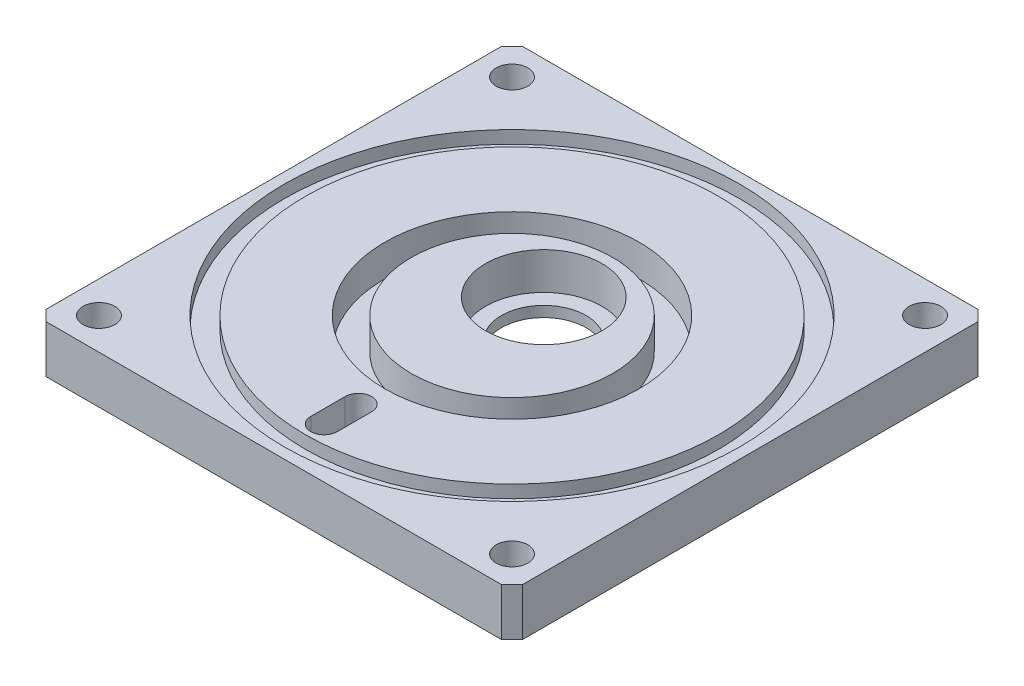
ISO-10303-21;
HEADER;
FILE_DESCRIPTION(('STEP AP214'),'2;1');
FILE_NAME('part.step','',(''),(''),'','','');
FILE_SCHEMA(('AUTOMOTIVE_DESIGN { 1 0 10303 214 1 1 1 1 }'));
ENDSEC;
DATA;
#1=APPLICATION_CONTEXT('core data for automotive mechanical design processes');
#2=APPLICATION_PROTOCOL_DEFINITION('international standard','automotive_design',2000,#1);
#3=PRODUCT_CONTEXT('',#1,'mechanical');
#4=PRODUCT('Part','Part','',(#3));
#5=PRODUCT_RELATED_PRODUCT_CATEGORY('part','',(#4));
#6=PRODUCT_DEFINITION_FORMATION('','',#4);
#7=PRODUCT_DEFINITION_CONTEXT('part definition',#1,'design');
#8=PRODUCT_DEFINITION('design','',#6,#7);
#9=PRODUCT_DEFINITION_SHAPE('','',#8);
#10=(LENGTH_UNIT() NAMED_UNIT(*) SI_UNIT(.MILLI.,.METRE.));
#11=(NAMED_UNIT(*) PLANE_ANGLE_UNIT() SI_UNIT($,.RADIAN.));
#12=(NAMED_UNIT(*) SI_UNIT($,.STERADIAN.) SOLID_ANGLE_UNIT());
#13=UNCERTAINTY_MEASURE_WITH_UNIT(LENGTH_MEASURE(1.E-05),#10,'distance_accuracy_value','');
#14=(GEOMETRIC_REPRESENTATION_CONTEXT(3) GLOBAL_UNCERTAINTY_ASSIGNED_CONTEXT((#13)) GLOBAL_UNIT_ASSIGNED_CONTEXT((#10,
#11,#12)) REPRESENTATION_CONTEXT('',''));
#15=CARTESIAN_POINT('',(0.,0.,0.));
#16=DIRECTION('',(0.,0.,1.));
#17=DIRECTION('',(1.,0.,0.));
#18=AXIS2_PLACEMENT_3D('',#15,#16,#17);
#19=CARTESIAN_POINT('',(0.,4.5,0.));
#20=DIRECTION('',(0.,-1.,0.));
#21=DIRECTION('',(0.,0.,-1.));
#22=AXIS2_PLACEMENT_3D('',#19,#20,#21);
#23=PLANE('',#22);
#24=DIRECTION('',(0.,0.,1.));
#25=VECTOR('',#24,1.);
#26=CARTESIAN_POINT('',(-1.25,4.5,14.5));
#27=LINE('',#26,#25);
#28=CARTESIAN_POINT('',(-1.25,4.5,14.5));
#29=VERTEX_POINT('',#28);
#30=CARTESIAN_POINT('',(-1.25,4.5,17.75));
#31=VERTEX_POINT('',#30);
#32=EDGE_CURVE('E173',#29,#31,#27,.T.);
#33=ORIENTED_EDGE('',*,*,#32,.F.);
#34=CARTESIAN_POINT('',(0.,4.5,14.5));
#35=DIRECTION('',(0.,1.,0.));
#36=DIRECTION('',(0.,0.,1.));
#37=AXIS2_PLACEMENT_3D('',#34,#35,#36);
#38=CIRCLE('',#37,1.25);
#39=CARTESIAN_POINT('',(1.25,4.5,14.5));
#40=VERTEX_POINT('',#39);
#41=EDGE_CURVE('E136',#40,#29,#38,.T.);
#42=ORIENTED_EDGE('',*,*,#41,.F.);
#43=DIRECTION('',(0.,0.,-1.));
#44=VECTOR('',#43,1.);
#45=CARTESIAN_POINT('',(1.25,4.5,14.5));
#46=LINE('',#45,#44);
#47=CARTESIAN_POINT('',(1.25,4.5,17.75));
#48=VERTEX_POINT('',#47);
#49=EDGE_CURVE('E157',#48,#40,#46,.T.);
#50=ORIENTED_EDGE('',*,*,#49,.F.);
#51=CARTESIAN_POINT('',(0.,4.5,17.75));
#52=DIRECTION('',(0.,1.,0.));
#53=DIRECTION('',(0.,0.,1.));
#54=AXIS2_PLACEMENT_3D('',#51,#52,#53);
#55=CIRCLE('',#54,1.25);
#56=EDGE_CURVE('E161',#31,#48,#55,.T.);
#57=ORIENTED_EDGE('',*,*,#56,.F.);
#58=EDGE_LOOP('',(#33,#42,#50,#57));
#59=FACE_BOUND('',#58,.T.);
#60=CARTESIAN_POINT('',(0.,4.5,0.));
#61=DIRECTION('',(0.,1.,0.));
#62=DIRECTION('',(0.,0.,1.));
#63=AXIS2_PLACEMENT_3D('',#60,#61,#62);
#64=CIRCLE('',#63,12.);
#65=CARTESIAN_POINT('',(0.,4.5,12.));
#66=VERTEX_POINT('',#65);
#67=EDGE_CURVE('E209',#66,#66,#64,.T.);
#68=ORIENTED_EDGE('',*,*,#67,.F.);
#69=EDGE_LOOP('',(#68));
#70=FACE_BOUND('',#69,.T.);
#71=CARTESIAN_POINT('',(0.,4.5,0.));
#72=DIRECTION('',(0.,1.,0.));
#73=DIRECTION('',(0.,0.,1.));
#74=AXIS2_PLACEMENT_3D('',#71,#72,#73);
#75=CIRCLE('',#74,19.5);
#76=CARTESIAN_POINT('',(0.,4.5,19.5));
#77=VERTEX_POINT('',#76);
#78=EDGE_CURVE('E183',#77,#77,#75,.T.);
#79=ORIENTED_EDGE('',*,*,#78,.T.);
#80=EDGE_LOOP('',(#79));
#81=FACE_BOUND('',#80,.T.);
#82=ADVANCED_FACE('F38',(#59,#70,#81),#23,.F.);
#83=CARTESIAN_POINT('',(0.,4.5,-3.));
#84=DIRECTION('',(0.,1.,0.));
#85=DIRECTION('',(0.,0.,1.));
#86=AXIS2_PLACEMENT_3D('',#83,#84,#85);
#87=CIRCLE('',#86,5.5);
#88=CARTESIAN_POINT('',(0.,4.5,2.5));
#89=VERTEX_POINT('',#88);
#90=EDGE_CURVE('E225',#89,#89,#87,.T.);
#91=ORIENTED_EDGE('',*,*,#90,.F.);
#92=EDGE_LOOP('',(#91));
#93=FACE_BOUND('',#92,.T.);
#94=CARTESIAN_POINT('',(0.,4.5,0.));
#95=DIRECTION('',(0.,1.,0.));
#96=DIRECTION('',(0.,0.,1.));
#97=AXIS2_PLACEMENT_3D('',#94,#95,#96);
#98=CIRCLE('',#97,9.5);
#99=CARTESIAN_POINT('',(0.,4.5,9.5));
#100=VERTEX_POINT('',#99);
#101=EDGE_CURVE('E201',#100,#100,#98,.T.);
#102=ORIENTED_EDGE('',*,*,#101,.T.);
#103=EDGE_LOOP('',(#102));
#104=FACE_BOUND('',#103,.T.);
#105=ADVANCED_FACE('F347',(#93,#104),#23,.F.);
#106=CARTESIAN_POINT('',(22.5,4.5,22.5));
#107=DIRECTION('',(-1.,0.,0.));
#108=DIRECTION('',(0.,0.,1.));
#109=AXIS2_PLACEMENT_3D('',#106,#107,#108);
#110=PLANE('',#109);
#111=DIRECTION('',(0.,0.,-1.));
#112=VECTOR('',#111,1.);
#113=CARTESIAN_POINT('',(22.5,0.,22.5));
#114=LINE('',#113,#112);
#115=CARTESIAN_POINT('',(22.5,0.,21.5));
#116=VERTEX_POINT('',#115);
#117=CARTESIAN_POINT('',(22.5,0.,-21.5));
#118=VERTEX_POINT('',#117);
#119=EDGE_CURVE('E233',#116,#118,#114,.T.);
#120=ORIENTED_EDGE('',*,*,#119,.T.);
#121=DIRECTION('',(0.,1.,0.));
#122=VECTOR('',#121,1.);
#123=CARTESIAN_POINT('',(22.5,4.5,-21.5));
#124=LINE('',#123,#122);
#125=CARTESIAN_POINT('',(22.5,4.5,-21.5));
#126=VERTEX_POINT('',#125);
#127=EDGE_CURVE('E288',#118,#126,#124,.T.);
#128=ORIENTED_EDGE('',*,*,#127,.T.);
#129=DIRECTION('',(0.,0.,-1.));
#130=VECTOR('',#129,1.);
#131=CARTESIAN_POINT('',(22.5,4.5,22.5));
#132=LINE('',#131,#130);
#133=CARTESIAN_POINT('',(22.5,4.5,21.5));
#134=VERTEX_POINT('',#133);
#135=EDGE_CURVE('E237',#134,#126,#132,.T.);
#136=ORIENTED_EDGE('',*,*,#135,.F.);
#137=DIRECTION('',(0.,-1.,0.));
#138=VECTOR('',#137,1.);
#139=CARTESIAN_POINT('',(22.5,4.5,21.5));
#140=LINE('',#139,#138);
#141=EDGE_CURVE('E284',#134,#116,#140,.T.);
#142=ORIENTED_EDGE('',*,*,#141,.T.);
#143=EDGE_LOOP('',(#120,#128,#136,#142));
#144=FACE_BOUND('',#143,.T.);
#145=ADVANCED_FACE('F332',(#144),#110,.F.);
#146=CARTESIAN_POINT('',(-22.5,4.5,-22.5));
#147=DIRECTION('',(0.,0.,1.));
#148=DIRECTION('',(1.,0.,0.));
#149=AXIS2_PLACEMENT_3D('',#146,#147,#148);
#150=PLANE('',#149);
#151=DIRECTION('',(-1.,0.,0.));
#152=VECTOR('',#151,1.);
#153=CARTESIAN_POINT('',(-22.5,4.5,-22.5));
#154=LINE('',#153,#152);
#155=CARTESIAN_POINT('',(21.5,4.5,-22.5));
#156=VERTEX_POINT('',#155);
#157=CARTESIAN_POINT('',(-21.5,4.5,-22.5));
#158=VERTEX_POINT('',#157);
#159=EDGE_CURVE('E241',#156,#158,#154,.T.);
#160=ORIENTED_EDGE('',*,*,#159,.F.);
#161=DIRECTION('',(0.,-1.,0.));
#162=VECTOR('',#161,1.);
#163=CARTESIAN_POINT('',(21.5,4.5,-22.5));
#164=LINE('',#163,#162);
#165=CARTESIAN_POINT('',(21.5,0.,-22.5));
#166=VERTEX_POINT('',#165);
#167=EDGE_CURVE('E268',#156,#166,#164,.T.);
#168=ORIENTED_EDGE('',*,*,#167,.T.);
#169=DIRECTION('',(-1.,0.,0.));
#170=VECTOR('',#169,1.);
#171=CARTESIAN_POINT('',(-22.5,0.,-22.5));
#172=LINE('',#171,#170);
#173=CARTESIAN_POINT('',(-21.5,0.,-22.5));
#174=VERTEX_POINT('',#173);
#175=EDGE_CURVE('E256',#166,#174,#172,.T.);
#176=ORIENTED_EDGE('',*,*,#175,.T.);
#177=DIRECTION('',(0.,1.,0.));
#178=VECTOR('',#177,1.);
#179=CARTESIAN_POINT('',(-21.5,4.5,-22.5));
#180=LINE('',#179,#178);
#181=EDGE_CURVE('E252',#174,#158,#180,.T.);
#182=ORIENTED_EDGE('',*,*,#181,.T.);
#183=EDGE_LOOP('',(#160,#168,#176,#182));
#184=FACE_BOUND('',#183,.T.);
#185=ADVANCED_FACE('F340',(#184),#150,.F.);
#186=CARTESIAN_POINT('',(-22.5,4.5,22.5));
#187=DIRECTION('',(1.,0.,0.));
#188=DIRECTION('',(0.,0.,-1.));
#189=AXIS2_PLACEMENT_3D('',#186,#187,#188);
#190=PLANE('',#189);
#191=DIRECTION('',(0.,0.,1.));
#192=VECTOR('',#191,1.);
#193=CARTESIAN_POINT('',(-22.5,0.,22.5));
#194=LINE('',#193,#192);
#195=CARTESIAN_POINT('',(-22.5,0.,-21.5));
#196=VERTEX_POINT('',#195);
#197=CARTESIAN_POINT('',(-22.5,0.,21.5));
#198=VERTEX_POINT('',#197);
#199=EDGE_CURVE('E260',#196,#198,#194,.T.);
#200=ORIENTED_EDGE('',*,*,#199,.T.);
#201=DIRECTION('',(0.,1.,0.));
#202=VECTOR('',#201,1.);
#203=CARTESIAN_POINT('',(-22.5,4.5,21.5));
#204=LINE('',#203,#202);
#205=CARTESIAN_POINT('',(-22.5,4.5,21.5));
#206=VERTEX_POINT('',#205);
#207=EDGE_CURVE('E11',#198,#206,#204,.T.);
#208=ORIENTED_EDGE('',*,*,#207,.T.);
#209=DIRECTION('',(0.,0.,1.));
#210=VECTOR('',#209,1.);
#211=CARTESIAN_POINT('',(-22.5,4.5,22.5));
#212=LINE('',#211,#210);
#213=CARTESIAN_POINT('',(-22.5,4.5,-21.5));
#214=VERTEX_POINT('',#213);
#215=EDGE_CURVE('E246',#214,#206,#212,.T.);
#216=ORIENTED_EDGE('',*,*,#215,.F.);
#217=DIRECTION('',(0.,-1.,0.));
#218=VECTOR('',#217,1.);
#219=CARTESIAN_POINT('',(-22.5,4.5,-21.5));
#220=LINE('',#219,#218);
#221=EDGE_CURVE('E47',#214,#196,#220,.T.);
#222=ORIENTED_EDGE('',*,*,#221,.T.);
#223=EDGE_LOOP('',(#200,#208,#216,#222));
#224=FACE_BOUND('',#223,.T.);
#225=ADVANCED_FACE('F313',(#224),#190,.F.);
#226=CARTESIAN_POINT('',(-22.5,4.5,22.5));
#227=DIRECTION('',(0.,0.,-1.));
#228=DIRECTION('',(-1.,0.,0.));
#229=AXIS2_PLACEMENT_3D('',#226,#227,#228);
#230=PLANE('',#229);
#231=DIRECTION('',(1.,0.,0.));
#232=VECTOR('',#231,1.);
#233=CARTESIAN_POINT('',(-22.5,0.,22.5));
#234=LINE('',#233,#232);
#235=CARTESIAN_POINT('',(-21.5,0.,22.5));
#236=VERTEX_POINT('',#235);
#237=CARTESIAN_POINT('',(21.5,0.,22.5));
#238=VERTEX_POINT('',#237);
#239=EDGE_CURVE('E242',#236,#238,#234,.T.);
#240=ORIENTED_EDGE('',*,*,#239,.T.);
#241=DIRECTION('',(0.,1.,0.));
#242=VECTOR('',#241,1.);
#243=CARTESIAN_POINT('',(21.5,4.5,22.5));
#244=LINE('',#243,#242);
#245=CARTESIAN_POINT('',(21.5,4.5,22.5));
#246=VERTEX_POINT('',#245);
#247=EDGE_CURVE('E54',#238,#246,#244,.T.);
#248=ORIENTED_EDGE('',*,*,#247,.T.);
#249=DIRECTION('',(1.,0.,0.));
#250=VECTOR('',#249,1.);
#251=CARTESIAN_POINT('',(-22.5,4.5,22.5));
#252=LINE('',#251,#250);
#253=CARTESIAN_POINT('',(-21.5,4.5,22.5));
#254=VERTEX_POINT('',#253);
#255=EDGE_CURVE('E249',#254,#246,#252,.T.);
#256=ORIENTED_EDGE('',*,*,#255,.F.);
#257=DIRECTION('',(0.,-1.,0.));
#258=VECTOR('',#257,1.);
#259=CARTESIAN_POINT('',(-21.5,4.5,22.5));
#260=LINE('',#259,#258);
#261=EDGE_CURVE('E302',#254,#236,#260,.T.);
#262=ORIENTED_EDGE('',*,*,#261,.T.);
#263=EDGE_LOOP('',(#240,#248,#256,#262));
#264=FACE_BOUND('',#263,.T.);
#265=ADVANCED_FACE('F323',(#264),#230,.F.);
#266=CARTESIAN_POINT('',(-19.5,4.5,-19.5));
#267=DIRECTION('',(0.,-1.,0.));
#268=DIRECTION('',(0.,0.,1.));
#269=AXIS2_PLACEMENT_3D('',#266,#267,#268);
#270=CIRCLE('',#269,1.5);
#271=CARTESIAN_POINT('',(-19.5,4.5,-18.));
#272=VERTEX_POINT('',#271);
#273=EDGE_CURVE('E371',#272,#272,#270,.T.);
#274=ORIENTED_EDGE('',*,*,#273,.T.);
#275=EDGE_LOOP('',(#274));
#276=FACE_BOUND('',#275,.T.);
#277=CARTESIAN_POINT('',(19.5,4.5,-19.5));
#278=DIRECTION('',(0.,-1.,0.));
#279=DIRECTION('',(0.,0.,-1.));
#280=AXIS2_PLACEMENT_3D('',#277,#278,#279);
#281=CIRCLE('',#280,1.5);
#282=CARTESIAN_POINT('',(19.5,4.5,-21.));
#283=VERTEX_POINT('',#282);
#284=EDGE_CURVE('E375',#283,#283,#281,.T.);
#285=ORIENTED_EDGE('',*,*,#284,.T.);
#286=EDGE_LOOP('',(#285));
#287=FACE_BOUND('',#286,.T.);
#288=CARTESIAN_POINT('',(19.5,4.5,19.5));
#289=DIRECTION('',(0.,-1.,0.));
#290=DIRECTION('',(0.,0.,1.));
#291=AXIS2_PLACEMENT_3D('',#288,#289,#290);
#292=CIRCLE('',#291,1.5);
#293=CARTESIAN_POINT('',(19.5,4.5,21.));
#294=VERTEX_POINT('',#293);
#295=EDGE_CURVE('E379',#294,#294,#292,.T.);
#296=ORIENTED_EDGE('',*,*,#295,.T.);
#297=EDGE_LOOP('',(#296));
#298=FACE_BOUND('',#297,.T.);
#299=CARTESIAN_POINT('',(-19.5,4.5,19.5));
#300=DIRECTION('',(0.,-1.,0.));
#301=DIRECTION('',(0.,0.,-1.));
#302=AXIS2_PLACEMENT_3D('',#299,#300,#301);
#303=CIRCLE('',#302,1.5);
#304=CARTESIAN_POINT('',(-19.5,4.5,18.));
#305=VERTEX_POINT('',#304);
#306=EDGE_CURVE('E174',#305,#305,#303,.T.);
#307=ORIENTED_EDGE('',*,*,#306,.T.);
#308=EDGE_LOOP('',(#307));
#309=FACE_BOUND('',#308,.T.);
#310=CARTESIAN_POINT('',(0.,4.5,0.));
#311=DIRECTION('',(0.,1.,0.));
#312=DIRECTION('',(0.,0.,1.));
#313=AXIS2_PLACEMENT_3D('',#310,#311,#312);
#314=CIRCLE('',#313,21.5);
#315=CARTESIAN_POINT('',(0.,4.5,21.5));
#316=VERTEX_POINT('',#315);
#317=EDGE_CURVE('E193',#316,#316,#314,.T.);
#318=ORIENTED_EDGE('',*,*,#317,.F.);
#319=EDGE_LOOP('',(#318));
#320=FACE_BOUND('',#319,.T.);
#321=ORIENTED_EDGE('',*,*,#135,.T.);
#322=DIRECTION('',(0.707106781186545,0.,0.70710678118655));
#323=VECTOR('',#322,1.);
#324=CARTESIAN_POINT('',(21.5,4.5,-22.5));
#325=LINE('',#324,#323);
#326=EDGE_CURVE('E299',#126,#156,#325,.F.);
#327=ORIENTED_EDGE('',*,*,#326,.T.);
#328=ORIENTED_EDGE('',*,*,#159,.T.);
#329=DIRECTION('',(0.70710678118655,0.,-0.707106781186545));
#330=VECTOR('',#329,1.);
#331=CARTESIAN_POINT('',(-22.5,4.5,-21.5));
#332=LINE('',#331,#330);
#333=EDGE_CURVE('E291',#158,#214,#332,.F.);
#334=ORIENTED_EDGE('',*,*,#333,.T.);
#335=ORIENTED_EDGE('',*,*,#215,.T.);
#336=DIRECTION('',(-0.707106781186545,0.,-0.70710678118655));
#337=VECTOR('',#336,1.);
#338=CARTESIAN_POINT('',(-21.5,4.5,22.5));
#339=LINE('',#338,#337);
#340=EDGE_CURVE('E61',#206,#254,#339,.F.);
#341=ORIENTED_EDGE('',*,*,#340,.T.);
#342=ORIENTED_EDGE('',*,*,#255,.T.);
#343=DIRECTION('',(-0.70710678118655,0.,0.707106781186545));
#344=VECTOR('',#343,1.);
#345=CARTESIAN_POINT('',(22.5,4.5,21.5));
#346=LINE('',#345,#344);
#347=EDGE_CURVE('E296',#246,#134,#346,.F.);
#348=ORIENTED_EDGE('',*,*,#347,.T.);
#349=EDGE_LOOP('',(#321,#327,#328,#334,#335,#341,#342,#348));
#350=FACE_BOUND('',#349,.T.);
#351=ADVANCED_FACE('F325',(#276,#287,#298,#309,#320,#350),#23,.F.);
#352=CARTESIAN_POINT('',(0.,0.,0.));
#353=DIRECTION('',(0.,-1.,0.));
#354=DIRECTION('',(0.,0.,-1.));
#355=AXIS2_PLACEMENT_3D('',#352,#353,#354);
#356=PLANE('',#355);
#357=CARTESIAN_POINT('',(-19.5,0.,-19.5));
#358=DIRECTION('',(0.,-1.,0.));
#359=DIRECTION('',(0.,0.,1.));
#360=AXIS2_PLACEMENT_3D('',#357,#358,#359);
#361=CIRCLE('',#360,1.5);
#362=CARTESIAN_POINT('',(-19.5,0.,-18.));
#363=VERTEX_POINT('',#362);
#364=EDGE_CURVE('E634',#363,#363,#361,.T.);
#365=ORIENTED_EDGE('',*,*,#364,.F.);
#366=EDGE_LOOP('',(#365));
#367=FACE_BOUND('',#366,.T.);
#368=CARTESIAN_POINT('',(19.5,0.,-19.5));
#369=DIRECTION('',(0.,-1.,0.));
#370=DIRECTION('',(0.,0.,-1.));
#371=AXIS2_PLACEMENT_3D('',#368,#369,#370);
#372=CIRCLE('',#371,1.5);
#373=CARTESIAN_POINT('',(19.5,0.,-21.));
#374=VERTEX_POINT('',#373);
#375=EDGE_CURVE('E638',#374,#374,#372,.T.);
#376=ORIENTED_EDGE('',*,*,#375,.F.);
#377=EDGE_LOOP('',(#376));
#378=FACE_BOUND('',#377,.T.);
#379=CARTESIAN_POINT('',(19.5,0.,19.5));
#380=DIRECTION('',(0.,-1.,0.));
#381=DIRECTION('',(0.,0.,1.));
#382=AXIS2_PLACEMENT_3D('',#379,#380,#381);
#383=CIRCLE('',#382,1.5);
#384=CARTESIAN_POINT('',(19.5,0.,21.));
#385=VERTEX_POINT('',#384);
#386=EDGE_CURVE('E647',#385,#385,#383,.T.);
#387=ORIENTED_EDGE('',*,*,#386,.F.);
#388=EDGE_LOOP('',(#387));
#389=FACE_BOUND('',#388,.T.);
#390=CARTESIAN_POINT('',(-19.5,0.,19.5));
#391=DIRECTION('',(0.,-1.,0.));
#392=DIRECTION('',(0.,0.,-1.));
#393=AXIS2_PLACEMENT_3D('',#390,#391,#392);
#394=CIRCLE('',#393,1.5);
#395=CARTESIAN_POINT('',(-19.5,0.,18.));
#396=VERTEX_POINT('',#395);
#397=EDGE_CURVE('E164',#396,#396,#394,.T.);
#398=ORIENTED_EDGE('',*,*,#397,.F.);
#399=EDGE_LOOP('',(#398));
#400=FACE_BOUND('',#399,.T.);
#401=CARTESIAN_POINT('',(0.,0.,14.5));
#402=DIRECTION('',(0.,1.,0.));
#403=DIRECTION('',(0.,0.,1.));
#404=AXIS2_PLACEMENT_3D('',#401,#402,#403);
#405=CIRCLE('',#404,1.25);
#406=CARTESIAN_POINT('',(1.25,0.,14.5));
#407=VERTEX_POINT('',#406);
#408=CARTESIAN_POINT('',(-1.25,0.,14.5));
#409=VERTEX_POINT('',#408);
#410=EDGE_CURVE('E133',#407,#409,#405,.T.);
#411=ORIENTED_EDGE('',*,*,#410,.T.);
#412=DIRECTION('',(0.,0.,1.));
#413=VECTOR('',#412,1.);
#414=CARTESIAN_POINT('',(-1.25,0.,14.5));
#415=LINE('',#414,#413);
#416=CARTESIAN_POINT('',(-1.25,0.,17.75));
#417=VERTEX_POINT('',#416);
#418=EDGE_CURVE('E146',#409,#417,#415,.T.);
#419=ORIENTED_EDGE('',*,*,#418,.T.);
#420=CARTESIAN_POINT('',(0.,0.,17.75));
#421=DIRECTION('',(0.,1.,0.));
#422=DIRECTION('',(0.,0.,1.));
#423=AXIS2_PLACEMENT_3D('',#420,#421,#422);
#424=CIRCLE('',#423,1.25);
#425=CARTESIAN_POINT('',(1.25,0.,17.75));
#426=VERTEX_POINT('',#425);
#427=EDGE_CURVE('E151',#417,#426,#424,.T.);
#428=ORIENTED_EDGE('',*,*,#427,.T.);
#429=DIRECTION('',(0.,0.,-1.));
#430=VECTOR('',#429,1.);
#431=CARTESIAN_POINT('',(1.25,0.,14.5));
#432=LINE('',#431,#430);
#433=EDGE_CURVE('E142',#426,#407,#432,.T.);
#434=ORIENTED_EDGE('',*,*,#433,.T.);
#435=EDGE_LOOP('',(#411,#419,#428,#434));
#436=FACE_BOUND('',#435,.T.);
#437=CARTESIAN_POINT('',(0.,0.,-3.));
#438=DIRECTION('',(0.,1.,0.));
#439=DIRECTION('',(0.,0.,1.));
#440=AXIS2_PLACEMENT_3D('',#437,#438,#439);
#441=CIRCLE('',#440,4.);
#442=CARTESIAN_POINT('',(0.,0.,1.));
#443=VERTEX_POINT('',#442);
#444=EDGE_CURVE('E221',#443,#443,#441,.T.);
#445=ORIENTED_EDGE('',*,*,#444,.T.);
#446=EDGE_LOOP('',(#445));
#447=FACE_BOUND('',#446,.T.);
#448=ORIENTED_EDGE('',*,*,#175,.F.);
#449=DIRECTION('',(-0.707106781186545,0.,-0.70710678118655));
#450=VECTOR('',#449,1.);
#451=CARTESIAN_POINT('',(22.0000000000001,0.,-21.9999999999999));
#452=LINE('',#451,#450);
#453=EDGE_CURVE('E281',#166,#118,#452,.F.);
#454=ORIENTED_EDGE('',*,*,#453,.T.);
#455=ORIENTED_EDGE('',*,*,#119,.F.);
#456=DIRECTION('',(0.70710678118655,0.,-0.707106781186545));
#457=VECTOR('',#456,1.);
#458=CARTESIAN_POINT('',(21.9999999999999,0.,22.0000000000001));
#459=LINE('',#458,#457);
#460=EDGE_CURVE('E278',#116,#238,#459,.F.);
#461=ORIENTED_EDGE('',*,*,#460,.T.);
#462=ORIENTED_EDGE('',*,*,#239,.F.);
#463=DIRECTION('',(0.707106781186545,0.,0.70710678118655));
#464=VECTOR('',#463,1.);
#465=CARTESIAN_POINT('',(-22.0000000000001,0.,21.9999999999999));
#466=LINE('',#465,#464);
#467=EDGE_CURVE('E275',#236,#198,#466,.F.);
#468=ORIENTED_EDGE('',*,*,#467,.T.);
#469=ORIENTED_EDGE('',*,*,#199,.F.);
#470=DIRECTION('',(-0.70710678118655,0.,0.707106781186545));
#471=VECTOR('',#470,1.);
#472=CARTESIAN_POINT('',(-21.9999999999999,0.,-22.0000000000001));
#473=LINE('',#472,#471);
#474=EDGE_CURVE('E272',#196,#174,#473,.F.);
#475=ORIENTED_EDGE('',*,*,#474,.T.);
#476=EDGE_LOOP('',(#448,#454,#455,#461,#462,#468,#469,#475));
#477=FACE_BOUND('',#476,.T.);
#478=ADVANCED_FACE('F153',(#367,#378,#389,#400,#436,#447,#477),#356,.T.);
#479=CARTESIAN_POINT('',(0.,1.,-3.));
#480=DIRECTION('',(0.,1.,0.));
#481=DIRECTION('',(0.,0.,1.));
#482=AXIS2_PLACEMENT_3D('',#479,#480,#481);
#483=CYLINDRICAL_SURFACE('',#482,5.5);
#484=CARTESIAN_POINT('',(0.,1.,-3.));
#485=DIRECTION('',(0.,1.,0.));
#486=DIRECTION('',(0.,0.,1.));
#487=AXIS2_PLACEMENT_3D('',#484,#485,#486);
#488=CIRCLE('',#487,5.5);
#489=CARTESIAN_POINT('',(0.,1.,2.5));
#490=VERTEX_POINT('',#489);
#491=EDGE_CURVE('E229',#490,#490,#488,.T.);
#492=ORIENTED_EDGE('',*,*,#491,.F.);
#493=EDGE_LOOP('',(#492));
#494=FACE_BOUND('',#493,.T.);
#495=ORIENTED_EDGE('',*,*,#90,.T.);
#496=EDGE_LOOP('',(#495));
#497=FACE_BOUND('',#496,.T.);
#498=ADVANCED_FACE('F365',(#494,#497),#483,.F.);
#499=CARTESIAN_POINT('',(0.,1.,-3.));
#500=DIRECTION('',(0.,1.,0.));
#501=DIRECTION('',(0.,0.,1.));
#502=AXIS2_PLACEMENT_3D('',#499,#500,#501);
#503=PLANE('',#502);
#504=CARTESIAN_POINT('',(0.,1.,-3.));
#505=DIRECTION('',(0.,1.,0.));
#506=DIRECTION('',(0.,0.,1.));
#507=AXIS2_PLACEMENT_3D('',#504,#505,#506);
#508=CIRCLE('',#507,4.);
#509=CARTESIAN_POINT('',(0.,1.,1.));
#510=VERTEX_POINT('',#509);
#511=EDGE_CURVE('E217',#510,#510,#508,.T.);
#512=ORIENTED_EDGE('',*,*,#511,.F.);
#513=EDGE_LOOP('',(#512));
#514=FACE_BOUND('',#513,.T.);
#515=ORIENTED_EDGE('',*,*,#491,.T.);
#516=EDGE_LOOP('',(#515));
#517=FACE_BOUND('',#516,.T.);
#518=ADVANCED_FACE('F415',(#514,#517),#503,.T.);
#519=CARTESIAN_POINT('',(0.,0.,-3.));
#520=DIRECTION('',(0.,1.,0.));
#521=DIRECTION('',(0.,0.,1.));
#522=AXIS2_PLACEMENT_3D('',#519,#520,#521);
#523=CYLINDRICAL_SURFACE('',#522,4.);
#524=ORIENTED_EDGE('',*,*,#444,.F.);
#525=EDGE_LOOP('',(#524));
#526=FACE_BOUND('',#525,.T.);
#527=ORIENTED_EDGE('',*,*,#511,.T.);
#528=EDGE_LOOP('',(#527));
#529=FACE_BOUND('',#528,.T.);
#530=ADVANCED_FACE('F411',(#526,#529),#523,.F.);
#531=CARTESIAN_POINT('',(0.,1.5,0.));
#532=DIRECTION('',(0.,1.,0.));
#533=DIRECTION('',(0.,0.,1.));
#534=AXIS2_PLACEMENT_3D('',#531,#532,#533);
#535=CYLINDRICAL_SURFACE('',#534,12.);
#536=CARTESIAN_POINT('',(0.,1.5,0.));
#537=DIRECTION('',(0.,1.,0.));
#538=DIRECTION('',(0.,0.,1.));
#539=AXIS2_PLACEMENT_3D('',#536,#537,#538);
#540=CIRCLE('',#539,12.);
#541=CARTESIAN_POINT('',(0.,1.5,12.));
#542=VERTEX_POINT('',#541);
#543=EDGE_CURVE('E213',#542,#542,#540,.T.);
#544=ORIENTED_EDGE('',*,*,#543,.F.);
#545=EDGE_LOOP('',(#544));
#546=FACE_BOUND('',#545,.T.);
#547=ORIENTED_EDGE('',*,*,#67,.T.);
#548=EDGE_LOOP('',(#547));
#549=FACE_BOUND('',#548,.T.);
#550=ADVANCED_FACE('F407',(#546,#549),#535,.F.);
#551=CARTESIAN_POINT('',(0.,1.5,0.));
#552=DIRECTION('',(0.,1.,0.));
#553=DIRECTION('',(0.,0.,1.));
#554=AXIS2_PLACEMENT_3D('',#551,#552,#553);
#555=PLANE('',#554);
#556=CARTESIAN_POINT('',(0.,1.5,0.));
#557=DIRECTION('',(0.,1.,0.));
#558=DIRECTION('',(0.,0.,1.));
#559=AXIS2_PLACEMENT_3D('',#556,#557,#558);
#560=CIRCLE('',#559,9.5);
#561=CARTESIAN_POINT('',(0.,1.5,9.5));
#562=VERTEX_POINT('',#561);
#563=EDGE_CURVE('E205',#562,#562,#560,.T.);
#564=ORIENTED_EDGE('',*,*,#563,.F.);
#565=EDGE_LOOP('',(#564));
#566=FACE_BOUND('',#565,.T.);
#567=ORIENTED_EDGE('',*,*,#543,.T.);
#568=EDGE_LOOP('',(#567));
#569=FACE_BOUND('',#568,.T.);
#570=ADVANCED_FACE('F399',(#566,#569),#555,.T.);
#571=CARTESIAN_POINT('',(0.,1.5,0.));
#572=DIRECTION('',(0.,1.,0.));
#573=DIRECTION('',(0.,0.,1.));
#574=AXIS2_PLACEMENT_3D('',#571,#572,#573);
#575=CYLINDRICAL_SURFACE('',#574,9.5);
#576=ORIENTED_EDGE('',*,*,#563,.T.);
#577=EDGE_LOOP('',(#576));
#578=FACE_BOUND('',#577,.T.);
#579=ORIENTED_EDGE('',*,*,#101,.F.);
#580=EDGE_LOOP('',(#579));
#581=FACE_BOUND('',#580,.T.);
#582=ADVANCED_FACE('F388',(#578,#581),#575,.T.);
#583=CARTESIAN_POINT('',(0.,3.3,0.));
#584=DIRECTION('',(0.,1.,0.));
#585=DIRECTION('',(0.,0.,1.));
#586=AXIS2_PLACEMENT_3D('',#583,#584,#585);
#587=CYLINDRICAL_SURFACE('',#586,21.5);
#588=CARTESIAN_POINT('',(0.,3.3,0.));
#589=DIRECTION('',(0.,1.,0.));
#590=DIRECTION('',(0.,0.,1.));
#591=AXIS2_PLACEMENT_3D('',#588,#589,#590);
#592=CIRCLE('',#591,21.5);
#593=CARTESIAN_POINT('',(0.,3.3,21.5));
#594=VERTEX_POINT('',#593);
#595=EDGE_CURVE('E197',#594,#594,#592,.T.);
#596=ORIENTED_EDGE('',*,*,#595,.F.);
#597=EDGE_LOOP('',(#596));
#598=FACE_BOUND('',#597,.T.);
#599=ORIENTED_EDGE('',*,*,#317,.T.);
#600=EDGE_LOOP('',(#599));
#601=FACE_BOUND('',#600,.T.);
#602=ADVANCED_FACE('F385',(#598,#601),#587,.F.);
#603=CARTESIAN_POINT('',(0.,3.3,0.));
#604=DIRECTION('',(0.,1.,0.));
#605=DIRECTION('',(0.,0.,1.));
#606=AXIS2_PLACEMENT_3D('',#603,#604,#605);
#607=PLANE('',#606);
#608=CARTESIAN_POINT('',(0.,3.3,0.));
#609=DIRECTION('',(0.,1.,0.));
#610=DIRECTION('',(0.,0.,1.));
#611=AXIS2_PLACEMENT_3D('',#608,#609,#610);
#612=CIRCLE('',#611,19.5);
#613=CARTESIAN_POINT('',(0.,3.3,19.5));
#614=VERTEX_POINT('',#613);
#615=EDGE_CURVE('E189',#614,#614,#612,.T.);
#616=ORIENTED_EDGE('',*,*,#615,.F.);
#617=EDGE_LOOP('',(#616));
#618=FACE_BOUND('',#617,.T.);
#619=ORIENTED_EDGE('',*,*,#595,.T.);
#620=EDGE_LOOP('',(#619));
#621=FACE_BOUND('',#620,.T.);
#622=ADVANCED_FACE('F387',(#618,#621),#607,.T.);
#623=CARTESIAN_POINT('',(0.,3.3,0.));
#624=DIRECTION('',(0.,1.,0.));
#625=DIRECTION('',(0.,0.,1.));
#626=AXIS2_PLACEMENT_3D('',#623,#624,#625);
#627=CYLINDRICAL_SURFACE('',#626,19.5);
#628=ORIENTED_EDGE('',*,*,#615,.T.);
#629=EDGE_LOOP('',(#628));
#630=FACE_BOUND('',#629,.T.);
#631=ORIENTED_EDGE('',*,*,#78,.F.);
#632=EDGE_LOOP('',(#631));
#633=FACE_BOUND('',#632,.T.);
#634=ADVANCED_FACE('F395',(#630,#633),#627,.T.);
#635=CARTESIAN_POINT('',(0.,0.,14.5));
#636=DIRECTION('',(0.,1.,0.));
#637=DIRECTION('',(0.,0.,1.));
#638=AXIS2_PLACEMENT_3D('',#635,#636,#637);
#639=CYLINDRICAL_SURFACE('',#638,1.25);
#640=ORIENTED_EDGE('',*,*,#41,.T.);
#641=DIRECTION('',(0.,1.,0.));
#642=VECTOR('',#641,1.);
#643=CARTESIAN_POINT('',(-1.25,0.,14.5));
#644=LINE('',#643,#642);
#645=EDGE_CURVE('E129',#409,#29,#644,.T.);
#646=ORIENTED_EDGE('',*,*,#645,.F.);
#647=ORIENTED_EDGE('',*,*,#410,.F.);
#648=DIRECTION('',(0.,1.,0.));
#649=VECTOR('',#648,1.);
#650=CARTESIAN_POINT('',(1.25,0.,14.5));
#651=LINE('',#650,#649);
#652=EDGE_CURVE('E180',#407,#40,#651,.T.);
#653=ORIENTED_EDGE('',*,*,#652,.T.);
#654=EDGE_LOOP('',(#640,#646,#647,#653));
#655=FACE_BOUND('',#654,.T.);
#656=ADVANCED_FACE('F131',(#655),#639,.F.);
#657=CARTESIAN_POINT('',(1.25,0.,14.5));
#658=DIRECTION('',(1.,0.,0.));
#659=DIRECTION('',(0.,0.,-1.));
#660=AXIS2_PLACEMENT_3D('',#657,#658,#659);
#661=PLANE('',#660);
#662=ORIENTED_EDGE('',*,*,#49,.T.);
#663=ORIENTED_EDGE('',*,*,#652,.F.);
#664=ORIENTED_EDGE('',*,*,#433,.F.);
#665=DIRECTION('',(0.,1.,0.));
#666=VECTOR('',#665,1.);
#667=CARTESIAN_POINT('',(1.25,0.,17.75));
#668=LINE('',#667,#666);
#669=EDGE_CURVE('E184',#426,#48,#668,.T.);
#670=ORIENTED_EDGE('',*,*,#669,.T.);
#671=EDGE_LOOP('',(#662,#663,#664,#670));
#672=FACE_BOUND('',#671,.T.);
#673=ADVANCED_FACE('F481',(#672),#661,.F.);
#674=CARTESIAN_POINT('',(0.,0.,17.75));
#675=DIRECTION('',(0.,1.,0.));
#676=DIRECTION('',(0.,0.,1.));
#677=AXIS2_PLACEMENT_3D('',#674,#675,#676);
#678=CYLINDRICAL_SURFACE('',#677,1.25);
#679=ORIENTED_EDGE('',*,*,#56,.T.);
#680=ORIENTED_EDGE('',*,*,#669,.F.);
#681=ORIENTED_EDGE('',*,*,#427,.F.);
#682=DIRECTION('',(0.,1.,0.));
#683=VECTOR('',#682,1.);
#684=CARTESIAN_POINT('',(-1.25,0.,17.75));
#685=LINE('',#684,#683);
#686=EDGE_CURVE('E141',#417,#31,#685,.T.);
#687=ORIENTED_EDGE('',*,*,#686,.T.);
#688=EDGE_LOOP('',(#679,#680,#681,#687));
#689=FACE_BOUND('',#688,.T.);
#690=ADVANCED_FACE('F489',(#689),#678,.F.);
#691=CARTESIAN_POINT('',(-1.25,0.,14.5));
#692=DIRECTION('',(-1.,0.,0.));
#693=DIRECTION('',(0.,0.,1.));
#694=AXIS2_PLACEMENT_3D('',#691,#692,#693);
#695=PLANE('',#694);
#696=ORIENTED_EDGE('',*,*,#32,.T.);
#697=ORIENTED_EDGE('',*,*,#686,.F.);
#698=ORIENTED_EDGE('',*,*,#418,.F.);
#699=ORIENTED_EDGE('',*,*,#645,.T.);
#700=EDGE_LOOP('',(#696,#697,#698,#699));
#701=FACE_BOUND('',#700,.T.);
#702=ADVANCED_FACE('F147',(#701),#695,.F.);
#703=CARTESIAN_POINT('',(-19.5,4.5,19.5));
#704=DIRECTION('',(0.,-1.,0.));
#705=DIRECTION('',(0.,0.,-1.));
#706=AXIS2_PLACEMENT_3D('',#703,#704,#705);
#707=CYLINDRICAL_SURFACE('',#706,1.5);
#708=ORIENTED_EDGE('',*,*,#306,.F.);
#709=EDGE_LOOP('',(#708));
#710=FACE_BOUND('',#709,.T.);
#711=ORIENTED_EDGE('',*,*,#397,.T.);
#712=EDGE_LOOP('',(#711));
#713=FACE_BOUND('',#712,.T.);
#714=ADVANCED_FACE('F506',(#710,#713),#707,.F.);
#715=CARTESIAN_POINT('',(19.5,4.5,19.5));
#716=DIRECTION('',(0.,-1.,0.));
#717=DIRECTION('',(0.,0.,-1.));
#718=AXIS2_PLACEMENT_3D('',#715,#716,#717);
#719=CYLINDRICAL_SURFACE('',#718,1.5);
#720=ORIENTED_EDGE('',*,*,#295,.F.);
#721=EDGE_LOOP('',(#720));
#722=FACE_BOUND('',#721,.T.);
#723=ORIENTED_EDGE('',*,*,#386,.T.);
#724=EDGE_LOOP('',(#723));
#725=FACE_BOUND('',#724,.T.);
#726=ADVANCED_FACE('F514',(#722,#725),#719,.F.);
#727=CARTESIAN_POINT('',(19.5,4.5,-19.5));
#728=DIRECTION('',(0.,-1.,0.));
#729=DIRECTION('',(0.,0.,-1.));
#730=AXIS2_PLACEMENT_3D('',#727,#728,#729);
#731=CYLINDRICAL_SURFACE('',#730,1.5);
#732=ORIENTED_EDGE('',*,*,#284,.F.);
#733=EDGE_LOOP('',(#732));
#734=FACE_BOUND('',#733,.T.);
#735=ORIENTED_EDGE('',*,*,#375,.T.);
#736=EDGE_LOOP('',(#735));
#737=FACE_BOUND('',#736,.T.);
#738=ADVANCED_FACE('F523',(#734,#737),#731,.F.);
#739=CARTESIAN_POINT('',(-19.5,4.5,-19.5));
#740=DIRECTION('',(0.,-1.,0.));
#741=DIRECTION('',(0.,0.,-1.));
#742=AXIS2_PLACEMENT_3D('',#739,#740,#741);
#743=CYLINDRICAL_SURFACE('',#742,1.5);
#744=ORIENTED_EDGE('',*,*,#273,.F.);
#745=EDGE_LOOP('',(#744));
#746=FACE_BOUND('',#745,.T.);
#747=ORIENTED_EDGE('',*,*,#364,.T.);
#748=EDGE_LOOP('',(#747));
#749=FACE_BOUND('',#748,.T.);
#750=ADVANCED_FACE('F532',(#746,#749),#743,.F.);
#751=CARTESIAN_POINT('',(21.5,4.5,-22.5));
#752=DIRECTION('',(-0.70710678118655,0.,0.707106781186545));
#753=DIRECTION('',(0.,-1.,0.));
#754=AXIS2_PLACEMENT_3D('',#751,#752,#753);
#755=PLANE('',#754);
#756=ORIENTED_EDGE('',*,*,#326,.F.);
#757=ORIENTED_EDGE('',*,*,#127,.F.);
#758=ORIENTED_EDGE('',*,*,#453,.F.);
#759=ORIENTED_EDGE('',*,*,#167,.F.);
#760=EDGE_LOOP('',(#756,#757,#758,#759));
#761=FACE_BOUND('',#760,.T.);
#762=ADVANCED_FACE('F337',(#761),#755,.F.);
#763=CARTESIAN_POINT('',(22.5,4.5,21.5));
#764=DIRECTION('',(-0.707106781186545,0.,-0.70710678118655));
#765=DIRECTION('',(0.,-1.,0.));
#766=AXIS2_PLACEMENT_3D('',#763,#764,#765);
#767=PLANE('',#766);
#768=ORIENTED_EDGE('',*,*,#347,.F.);
#769=ORIENTED_EDGE('',*,*,#247,.F.);
#770=ORIENTED_EDGE('',*,*,#460,.F.);
#771=ORIENTED_EDGE('',*,*,#141,.F.);
#772=EDGE_LOOP('',(#768,#769,#770,#771));
#773=FACE_BOUND('',#772,.T.);
#774=ADVANCED_FACE('F329',(#773),#767,.F.);
#775=CARTESIAN_POINT('',(-21.5,4.5,22.5));
#776=DIRECTION('',(0.70710678118655,0.,-0.707106781186545));
#777=DIRECTION('',(0.,-1.,0.));
#778=AXIS2_PLACEMENT_3D('',#775,#776,#777);
#779=PLANE('',#778);
#780=ORIENTED_EDGE('',*,*,#340,.F.);
#781=ORIENTED_EDGE('',*,*,#207,.F.);
#782=ORIENTED_EDGE('',*,*,#467,.F.);
#783=ORIENTED_EDGE('',*,*,#261,.F.);
#784=EDGE_LOOP('',(#780,#781,#782,#783));
#785=FACE_BOUND('',#784,.T.);
#786=ADVANCED_FACE('F322',(#785),#779,.F.);
#787=CARTESIAN_POINT('',(-22.5,4.5,-21.5));
#788=DIRECTION('',(0.707106781186545,0.,0.70710678118655));
#789=DIRECTION('',(0.,-1.,0.));
#790=AXIS2_PLACEMENT_3D('',#787,#788,#789);
#791=PLANE('',#790);
#792=ORIENTED_EDGE('',*,*,#333,.F.);
#793=ORIENTED_EDGE('',*,*,#181,.F.);
#794=ORIENTED_EDGE('',*,*,#474,.F.);
#795=ORIENTED_EDGE('',*,*,#221,.F.);
#796=EDGE_LOOP('',(#792,#793,#794,#795));
#797=FACE_BOUND('',#796,.T.);
#798=ADVANCED_FACE('F40',(#797),#791,.F.);
#799=CLOSED_SHELL('',(#82,#105,#145,#185,#225,#265,#351,#478,#498,#518,#530,#550,#570,#582,#602,
#622,#634,#656,#673,#690,#702,#714,#726,#738,#750,#762,#774,#786,#798));
#800=MANIFOLD_SOLID_BREP('B2',#799);
#801=ADVANCED_BREP_SHAPE_REPRESENTATION('',(#18,#800),#14);
#802=SHAPE_DEFINITION_REPRESENTATION(#9,#801);
ENDSEC;
END-ISO-10303-21;
